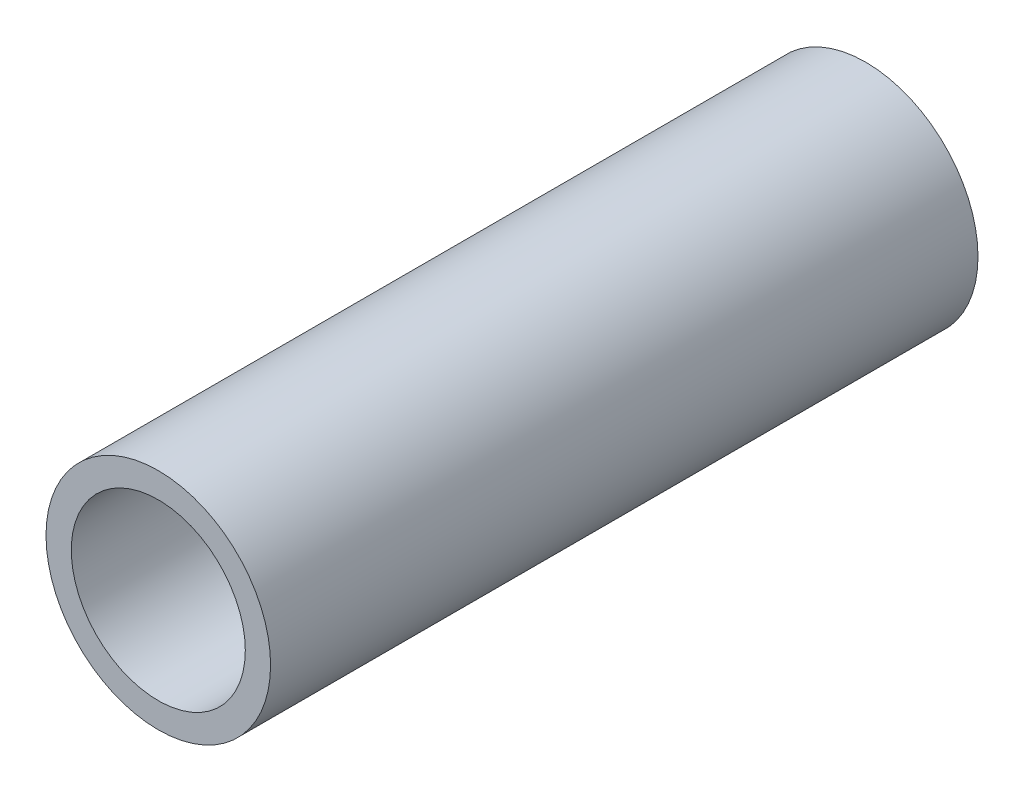
ISO-10303-21;
HEADER;
FILE_DESCRIPTION(('STEP AP214'),'2;1');
FILE_NAME('part.step','',(''),(''),'','','');
FILE_SCHEMA(('AUTOMOTIVE_DESIGN { 1 0 10303 214 1 1 1 1 }'));
ENDSEC;
DATA;
#1=APPLICATION_CONTEXT('core data for automotive mechanical design processes');
#2=APPLICATION_PROTOCOL_DEFINITION('international standard','automotive_design',2000,#1);
#3=PRODUCT_CONTEXT('',#1,'mechanical');
#4=PRODUCT('Part','Part','',(#3));
#5=PRODUCT_RELATED_PRODUCT_CATEGORY('part','',(#4));
#6=PRODUCT_DEFINITION_FORMATION('','',#4);
#7=PRODUCT_DEFINITION_CONTEXT('part definition',#1,'design');
#8=PRODUCT_DEFINITION('design','',#6,#7);
#9=PRODUCT_DEFINITION_SHAPE('','',#8);
#10=(LENGTH_UNIT() NAMED_UNIT(*) SI_UNIT(.MILLI.,.METRE.));
#11=(NAMED_UNIT(*) PLANE_ANGLE_UNIT() SI_UNIT($,.RADIAN.));
#12=(NAMED_UNIT(*) SI_UNIT($,.STERADIAN.) SOLID_ANGLE_UNIT());
#13=UNCERTAINTY_MEASURE_WITH_UNIT(LENGTH_MEASURE(1.E-05),#10,'distance_accuracy_value','');
#14=(GEOMETRIC_REPRESENTATION_CONTEXT(3) GLOBAL_UNCERTAINTY_ASSIGNED_CONTEXT((#13)) GLOBAL_UNIT_ASSIGNED_CONTEXT((#10,
#11,#12)) REPRESENTATION_CONTEXT('',''));
#15=CARTESIAN_POINT('',(0.,0.,0.));
#16=DIRECTION('',(0.,0.,1.));
#17=DIRECTION('',(1.,0.,0.));
#18=AXIS2_PLACEMENT_3D('',#15,#16,#17);
#19=CARTESIAN_POINT('',(0.,0.,6.3));
#20=DIRECTION('',(0.,0.,1.));
#21=DIRECTION('',(1.,0.,0.));
#22=AXIS2_PLACEMENT_3D('',#19,#20,#21);
#23=PLANE('',#22);
#24=CARTESIAN_POINT('',(0.,0.,6.3));
#25=DIRECTION('',(0.,0.,1.));
#26=DIRECTION('',(1.,0.,0.));
#27=AXIS2_PLACEMENT_3D('',#24,#25,#26);
#28=CIRCLE('',#27,1.);
#29=CARTESIAN_POINT('',(1.,0.,6.3));
#30=VERTEX_POINT('',#29);
#31=EDGE_CURVE('E10',#30,#30,#28,.T.);
#32=ORIENTED_EDGE('',*,*,#31,.T.);
#33=EDGE_LOOP('',(#32));
#34=FACE_BOUND('',#33,.T.);
#35=CARTESIAN_POINT('',(0.,0.,6.3));
#36=DIRECTION('',(0.,0.,1.));
#37=DIRECTION('',(1.,0.,0.));
#38=AXIS2_PLACEMENT_3D('',#35,#36,#37);
#39=CIRCLE('',#38,0.775);
#40=CARTESIAN_POINT('',(0.775,0.,6.3));
#41=VERTEX_POINT('',#40);
#42=EDGE_CURVE('E46',#41,#41,#39,.T.);
#43=ORIENTED_EDGE('',*,*,#42,.F.);
#44=EDGE_LOOP('',(#43));
#45=FACE_BOUND('',#44,.T.);
#46=ADVANCED_FACE('F35',(#34,#45),#23,.T.);
#47=CARTESIAN_POINT('',(0.,0.,0.));
#48=DIRECTION('',(0.,0.,1.));
#49=DIRECTION('',(1.,0.,0.));
#50=AXIS2_PLACEMENT_3D('',#47,#48,#49);
#51=PLANE('',#50);
#52=CARTESIAN_POINT('',(0.,0.,0.));
#53=DIRECTION('',(0.,0.,1.));
#54=DIRECTION('',(1.,0.,0.));
#55=AXIS2_PLACEMENT_3D('',#52,#53,#54);
#56=CIRCLE('',#55,1.);
#57=CARTESIAN_POINT('',(1.,0.,0.));
#58=VERTEX_POINT('',#57);
#59=EDGE_CURVE('E39',#58,#58,#56,.T.);
#60=ORIENTED_EDGE('',*,*,#59,.F.);
#61=EDGE_LOOP('',(#60));
#62=FACE_BOUND('',#61,.T.);
#63=CARTESIAN_POINT('',(0.,0.,0.));
#64=DIRECTION('',(0.,0.,1.));
#65=DIRECTION('',(1.,0.,0.));
#66=AXIS2_PLACEMENT_3D('',#63,#64,#65);
#67=CIRCLE('',#66,0.775);
#68=CARTESIAN_POINT('',(0.775,0.,0.));
#69=VERTEX_POINT('',#68);
#70=EDGE_CURVE('E48',#69,#69,#67,.T.);
#71=ORIENTED_EDGE('',*,*,#70,.T.);
#72=EDGE_LOOP('',(#71));
#73=FACE_BOUND('',#72,.T.);
#74=ADVANCED_FACE('F58',(#62,#73),#51,.F.);
#75=CARTESIAN_POINT('',(0.,0.,6.3));
#76=DIRECTION('',(0.,0.,-1.));
#77=DIRECTION('',(-1.,0.,0.));
#78=AXIS2_PLACEMENT_3D('',#75,#76,#77);
#79=CYLINDRICAL_SURFACE('',#78,1.);
#80=ORIENTED_EDGE('',*,*,#31,.F.);
#81=EDGE_LOOP('',(#80));
#82=FACE_BOUND('',#81,.T.);
#83=ORIENTED_EDGE('',*,*,#59,.T.);
#84=EDGE_LOOP('',(#83));
#85=FACE_BOUND('',#84,.T.);
#86=ADVANCED_FACE('F37',(#82,#85),#79,.T.);
#87=CARTESIAN_POINT('',(0.,0.,6.3));
#88=DIRECTION('',(0.,0.,-1.));
#89=DIRECTION('',(-1.,0.,0.));
#90=AXIS2_PLACEMENT_3D('',#87,#88,#89);
#91=CYLINDRICAL_SURFACE('',#90,0.775);
#92=ORIENTED_EDGE('',*,*,#42,.T.);
#93=EDGE_LOOP('',(#92));
#94=FACE_BOUND('',#93,.T.);
#95=ORIENTED_EDGE('',*,*,#70,.F.);
#96=EDGE_LOOP('',(#95));
#97=FACE_BOUND('',#96,.T.);
#98=ADVANCED_FACE('F54',(#94,#97),#91,.F.);
#99=CLOSED_SHELL('',(#46,#74,#86,#98));
#100=MANIFOLD_SOLID_BREP('B2',#99);
#101=ADVANCED_BREP_SHAPE_REPRESENTATION('',(#18,#100),#14);
#102=SHAPE_DEFINITION_REPRESENTATION(#9,#101);
ENDSEC;
END-ISO-10303-21;
